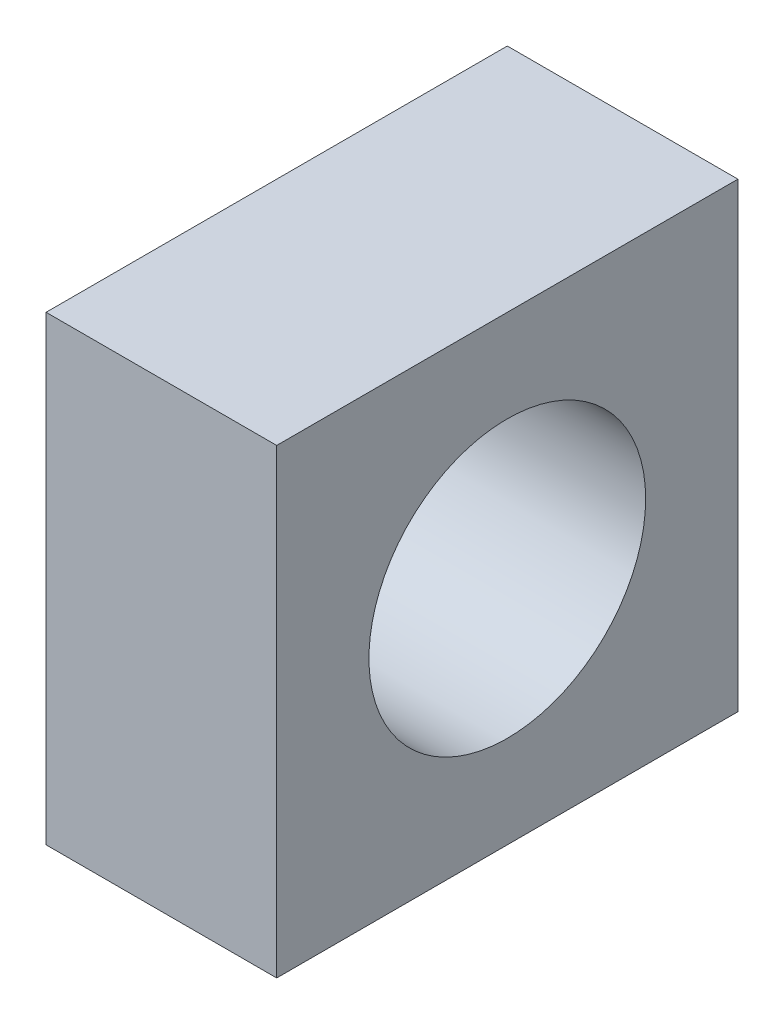
ISO-10303-21;
HEADER;
FILE_DESCRIPTION(('STEP AP214'),'2;1');
FILE_NAME('part.step','',(''),(''),'','','');
FILE_SCHEMA(('AUTOMOTIVE_DESIGN { 1 0 10303 214 1 1 1 1 }'));
ENDSEC;
DATA;
#1=APPLICATION_CONTEXT('core data for automotive mechanical design processes');
#2=APPLICATION_PROTOCOL_DEFINITION('international standard','automotive_design',2000,#1);
#3=PRODUCT_CONTEXT('',#1,'mechanical');
#4=PRODUCT('Part','Part','',(#3));
#5=PRODUCT_RELATED_PRODUCT_CATEGORY('part','',(#4));
#6=PRODUCT_DEFINITION_FORMATION('','',#4);
#7=PRODUCT_DEFINITION_CONTEXT('part definition',#1,'design');
#8=PRODUCT_DEFINITION('design','',#6,#7);
#9=PRODUCT_DEFINITION_SHAPE('','',#8);
#10=(LENGTH_UNIT() NAMED_UNIT(*) SI_UNIT(.MILLI.,.METRE.));
#11=(NAMED_UNIT(*) PLANE_ANGLE_UNIT() SI_UNIT($,.RADIAN.));
#12=(NAMED_UNIT(*) SI_UNIT($,.STERADIAN.) SOLID_ANGLE_UNIT());
#13=UNCERTAINTY_MEASURE_WITH_UNIT(LENGTH_MEASURE(1.E-05),#10,'distance_accuracy_value','');
#14=(GEOMETRIC_REPRESENTATION_CONTEXT(3) GLOBAL_UNCERTAINTY_ASSIGNED_CONTEXT((#13)) GLOBAL_UNIT_ASSIGNED_CONTEXT((#10,
#11,#12)) REPRESENTATION_CONTEXT('',''));
#15=CARTESIAN_POINT('',(0.,0.,0.));
#16=DIRECTION('',(0.,0.,1.));
#17=DIRECTION('',(1.,0.,0.));
#18=AXIS2_PLACEMENT_3D('',#15,#16,#17);
#19=CARTESIAN_POINT('',(1.,0.,0.));
#20=DIRECTION('',(-1.,0.,0.));
#21=DIRECTION('',(0.,0.,1.));
#22=AXIS2_PLACEMENT_3D('',#19,#20,#21);
#23=PLANE('',#22);
#24=DIRECTION('',(0.,1.,0.));
#25=VECTOR('',#24,1.);
#26=CARTESIAN_POINT('',(1.,-1.,1.));
#27=LINE('',#26,#25);
#28=CARTESIAN_POINT('',(1.,-1.,1.));
#29=VERTEX_POINT('',#28);
#30=CARTESIAN_POINT('',(1.,1.,1.));
#31=VERTEX_POINT('',#30);
#32=EDGE_CURVE('E113',#29,#31,#27,.T.);
#33=ORIENTED_EDGE('',*,*,#32,.F.);
#34=DIRECTION('',(0.,0.,-1.));
#35=VECTOR('',#34,1.);
#36=CARTESIAN_POINT('',(1.,-1.,1.));
#37=LINE('',#36,#35);
#38=CARTESIAN_POINT('',(1.,-1.,-1.));
#39=VERTEX_POINT('',#38);
#40=EDGE_CURVE('E103',#29,#39,#37,.T.);
#41=ORIENTED_EDGE('',*,*,#40,.T.);
#42=DIRECTION('',(0.,1.,0.));
#43=VECTOR('',#42,1.);
#44=CARTESIAN_POINT('',(1.,-1.,-1.));
#45=LINE('',#44,#43);
#46=CARTESIAN_POINT('',(1.,1.,-1.));
#47=VERTEX_POINT('',#46);
#48=EDGE_CURVE('E98',#39,#47,#45,.T.);
#49=ORIENTED_EDGE('',*,*,#48,.T.);
#50=DIRECTION('',(0.,0.,-1.));
#51=VECTOR('',#50,1.);
#52=CARTESIAN_POINT('',(1.,1.,1.));
#53=LINE('',#52,#51);
#54=EDGE_CURVE('E102',#31,#47,#53,.T.);
#55=ORIENTED_EDGE('',*,*,#54,.F.);
#56=EDGE_LOOP('',(#33,#41,#49,#55));
#57=FACE_BOUND('',#56,.T.);
#58=CARTESIAN_POINT('',(1.,0.,0.));
#59=DIRECTION('',(1.,0.,0.));
#60=DIRECTION('',(0.,0.,-1.));
#61=AXIS2_PLACEMENT_3D('',#58,#59,#60);
#62=CIRCLE('',#61,0.6);
#63=CARTESIAN_POINT('',(1.,0.,-0.600000000000001));
#64=VERTEX_POINT('',#63);
#65=EDGE_CURVE('E123',#64,#64,#62,.T.);
#66=ORIENTED_EDGE('',*,*,#65,.F.);
#67=EDGE_LOOP('',(#66));
#68=FACE_BOUND('',#67,.T.);
#69=ADVANCED_FACE('F52',(#57,#68),#23,.F.);
#70=CARTESIAN_POINT('',(0.,0.,0.));
#71=DIRECTION('',(-1.,0.,0.));
#72=DIRECTION('',(0.,0.,1.));
#73=AXIS2_PLACEMENT_3D('',#70,#71,#72);
#74=PLANE('',#73);
#75=DIRECTION('',(0.,1.,0.));
#76=VECTOR('',#75,1.);
#77=CARTESIAN_POINT('',(0.,-1.,1.));
#78=LINE('',#77,#76);
#79=CARTESIAN_POINT('',(0.,-1.,1.));
#80=VERTEX_POINT('',#79);
#81=CARTESIAN_POINT('',(0.,1.,1.));
#82=VERTEX_POINT('',#81);
#83=EDGE_CURVE('E119',#80,#82,#78,.T.);
#84=ORIENTED_EDGE('',*,*,#83,.T.);
#85=DIRECTION('',(0.,0.,-1.));
#86=VECTOR('',#85,1.);
#87=CARTESIAN_POINT('',(0.,1.,1.));
#88=LINE('',#87,#86);
#89=CARTESIAN_POINT('',(0.,1.,-1.));
#90=VERTEX_POINT('',#89);
#91=EDGE_CURVE('E122',#82,#90,#88,.T.);
#92=ORIENTED_EDGE('',*,*,#91,.T.);
#93=DIRECTION('',(0.,1.,0.));
#94=VECTOR('',#93,1.);
#95=CARTESIAN_POINT('',(0.,-1.,-1.));
#96=LINE('',#95,#94);
#97=CARTESIAN_POINT('',(0.,-1.,-1.));
#98=VERTEX_POINT('',#97);
#99=EDGE_CURVE('E110',#98,#90,#96,.T.);
#100=ORIENTED_EDGE('',*,*,#99,.F.);
#101=DIRECTION('',(0.,0.,-1.));
#102=VECTOR('',#101,1.);
#103=CARTESIAN_POINT('',(0.,-1.,1.));
#104=LINE('',#103,#102);
#105=EDGE_CURVE('E86',#80,#98,#104,.T.);
#106=ORIENTED_EDGE('',*,*,#105,.F.);
#107=EDGE_LOOP('',(#84,#92,#100,#106));
#108=FACE_BOUND('',#107,.T.);
#109=CARTESIAN_POINT('',(0.,0.,0.));
#110=DIRECTION('',(1.,0.,0.));
#111=DIRECTION('',(0.,0.,-1.));
#112=AXIS2_PLACEMENT_3D('',#109,#110,#111);
#113=CIRCLE('',#112,0.6);
#114=CARTESIAN_POINT('',(0.,0.,-0.600000000000001));
#115=VERTEX_POINT('',#114);
#116=EDGE_CURVE('E158',#115,#115,#113,.T.);
#117=ORIENTED_EDGE('',*,*,#116,.T.);
#118=EDGE_LOOP('',(#117));
#119=FACE_BOUND('',#118,.T.);
#120=ADVANCED_FACE('F128',(#108,#119),#74,.T.);
#121=CARTESIAN_POINT('',(1.,-1.,1.));
#122=DIRECTION('',(0.,0.,1.));
#123=DIRECTION('',(1.,0.,0.));
#124=AXIS2_PLACEMENT_3D('',#121,#122,#123);
#125=PLANE('',#124);
#126=ORIENTED_EDGE('',*,*,#83,.F.);
#127=DIRECTION('',(-1.,0.,0.));
#128=VECTOR('',#127,1.);
#129=CARTESIAN_POINT('',(1.,-1.,1.));
#130=LINE('',#129,#128);
#131=EDGE_CURVE('E12',#29,#80,#130,.T.);
#132=ORIENTED_EDGE('',*,*,#131,.F.);
#133=ORIENTED_EDGE('',*,*,#32,.T.);
#134=DIRECTION('',(-1.,0.,0.));
#135=VECTOR('',#134,1.);
#136=CARTESIAN_POINT('',(1.,1.,1.));
#137=LINE('',#136,#135);
#138=EDGE_CURVE('E56',#31,#82,#137,.T.);
#139=ORIENTED_EDGE('',*,*,#138,.T.);
#140=EDGE_LOOP('',(#126,#132,#133,#139));
#141=FACE_BOUND('',#140,.T.);
#142=ADVANCED_FACE('F54',(#141),#125,.T.);
#143=CARTESIAN_POINT('',(1.,-1.,1.));
#144=DIRECTION('',(0.,1.,0.));
#145=DIRECTION('',(0.,0.,1.));
#146=AXIS2_PLACEMENT_3D('',#143,#144,#145);
#147=PLANE('',#146);
#148=ORIENTED_EDGE('',*,*,#105,.T.);
#149=DIRECTION('',(-1.,0.,0.));
#150=VECTOR('',#149,1.);
#151=CARTESIAN_POINT('',(1.,-1.,-1.));
#152=LINE('',#151,#150);
#153=EDGE_CURVE('E62',#39,#98,#152,.T.);
#154=ORIENTED_EDGE('',*,*,#153,.F.);
#155=ORIENTED_EDGE('',*,*,#40,.F.);
#156=ORIENTED_EDGE('',*,*,#131,.T.);
#157=EDGE_LOOP('',(#148,#154,#155,#156));
#158=FACE_BOUND('',#157,.T.);
#159=ADVANCED_FACE('F131',(#158),#147,.F.);
#160=CARTESIAN_POINT('',(1.,-1.,-1.));
#161=DIRECTION('',(0.,0.,1.));
#162=DIRECTION('',(1.,0.,0.));
#163=AXIS2_PLACEMENT_3D('',#160,#161,#162);
#164=PLANE('',#163);
#165=ORIENTED_EDGE('',*,*,#99,.T.);
#166=DIRECTION('',(-1.,0.,0.));
#167=VECTOR('',#166,1.);
#168=CARTESIAN_POINT('',(1.,1.,-1.));
#169=LINE('',#168,#167);
#170=EDGE_CURVE('E107',#47,#90,#169,.T.);
#171=ORIENTED_EDGE('',*,*,#170,.F.);
#172=ORIENTED_EDGE('',*,*,#48,.F.);
#173=ORIENTED_EDGE('',*,*,#153,.T.);
#174=EDGE_LOOP('',(#165,#171,#172,#173));
#175=FACE_BOUND('',#174,.T.);
#176=ADVANCED_FACE('F108',(#175),#164,.F.);
#177=CARTESIAN_POINT('',(1.,1.,1.));
#178=DIRECTION('',(0.,1.,0.));
#179=DIRECTION('',(0.,0.,1.));
#180=AXIS2_PLACEMENT_3D('',#177,#178,#179);
#181=PLANE('',#180);
#182=ORIENTED_EDGE('',*,*,#91,.F.);
#183=ORIENTED_EDGE('',*,*,#138,.F.);
#184=ORIENTED_EDGE('',*,*,#54,.T.);
#185=ORIENTED_EDGE('',*,*,#170,.T.);
#186=EDGE_LOOP('',(#182,#183,#184,#185));
#187=FACE_BOUND('',#186,.T.);
#188=ADVANCED_FACE('F112',(#187),#181,.T.);
#189=CARTESIAN_POINT('',(1.,0.,0.));
#190=DIRECTION('',(-1.,0.,0.));
#191=DIRECTION('',(0.,0.,1.));
#192=AXIS2_PLACEMENT_3D('',#189,#190,#191);
#193=CYLINDRICAL_SURFACE('',#192,0.6);
#194=ORIENTED_EDGE('',*,*,#65,.T.);
#195=EDGE_LOOP('',(#194));
#196=FACE_BOUND('',#195,.T.);
#197=ORIENTED_EDGE('',*,*,#116,.F.);
#198=EDGE_LOOP('',(#197));
#199=FACE_BOUND('',#198,.T.);
#200=ADVANCED_FACE('F143',(#196,#199),#193,.F.);
#201=CLOSED_SHELL('',(#69,#120,#142,#159,#176,#188,#200));
#202=MANIFOLD_SOLID_BREP('B2',#201);
#203=ADVANCED_BREP_SHAPE_REPRESENTATION('',(#18,#202),#14);
#204=SHAPE_DEFINITION_REPRESENTATION(#9,#203);
ENDSEC;
END-ISO-10303-21;
